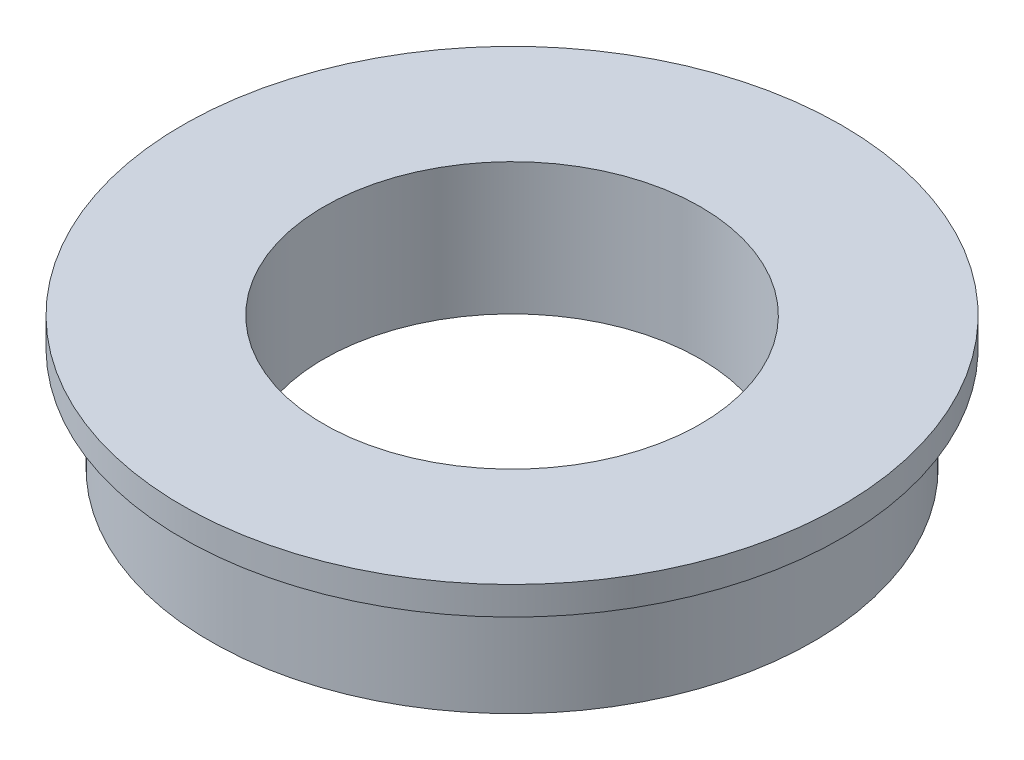
ISO-10303-21;
HEADER;
FILE_DESCRIPTION(('STEP AP214'),'2;1');
FILE_NAME('part.step','',(''),(''),'','','');
FILE_SCHEMA(('AUTOMOTIVE_DESIGN { 1 0 10303 214 1 1 1 1 }'));
ENDSEC;
DATA;
#1=APPLICATION_CONTEXT('core data for automotive mechanical design processes');
#2=APPLICATION_PROTOCOL_DEFINITION('international standard','automotive_design',2000,#1);
#3=PRODUCT_CONTEXT('',#1,'mechanical');
#4=PRODUCT('Part','Part','',(#3));
#5=PRODUCT_RELATED_PRODUCT_CATEGORY('part','',(#4));
#6=PRODUCT_DEFINITION_FORMATION('','',#4);
#7=PRODUCT_DEFINITION_CONTEXT('part definition',#1,'design');
#8=PRODUCT_DEFINITION('design','',#6,#7);
#9=PRODUCT_DEFINITION_SHAPE('','',#8);
#10=(LENGTH_UNIT() NAMED_UNIT(*) SI_UNIT(.MILLI.,.METRE.));
#11=(NAMED_UNIT(*) PLANE_ANGLE_UNIT() SI_UNIT($,.RADIAN.));
#12=(NAMED_UNIT(*) SI_UNIT($,.STERADIAN.) SOLID_ANGLE_UNIT());
#13=UNCERTAINTY_MEASURE_WITH_UNIT(LENGTH_MEASURE(1.E-05),#10,'distance_accuracy_value','');
#14=(GEOMETRIC_REPRESENTATION_CONTEXT(3) GLOBAL_UNCERTAINTY_ASSIGNED_CONTEXT((#13)) GLOBAL_UNIT_ASSIGNED_CONTEXT((#10,
#11,#12)) REPRESENTATION_CONTEXT('',''));
#15=CARTESIAN_POINT('',(0.,0.,0.));
#16=DIRECTION('',(0.,0.,1.));
#17=DIRECTION('',(1.,0.,0.));
#18=AXIS2_PLACEMENT_3D('',#15,#16,#17);
#19=CARTESIAN_POINT('',(0.,-7.37837869532181,0.));
#20=DIRECTION('',(0.,-1.,0.));
#21=DIRECTION('',(0.,0.,-1.));
#22=AXIS2_PLACEMENT_3D('',#19,#20,#21);
#23=CYLINDRICAL_SURFACE('',#22,10.);
#24=CARTESIAN_POINT('',(0.,-7.,0.));
#25=DIRECTION('',(0.,-1.,0.));
#26=DIRECTION('',(0.,0.,-1.));
#27=AXIS2_PLACEMENT_3D('',#24,#25,#26);
#28=CIRCLE('',#27,10.);
#29=CARTESIAN_POINT('',(0.,-7.,-10.));
#30=VERTEX_POINT('',#29);
#31=EDGE_CURVE('E56',#30,#30,#28,.T.);
#32=ORIENTED_EDGE('',*,*,#31,.T.);
#33=EDGE_LOOP('',(#32));
#34=FACE_BOUND('',#33,.T.);
#35=CARTESIAN_POINT('',(0.,0.,0.));
#36=DIRECTION('',(0.,-1.,0.));
#37=DIRECTION('',(0.,0.,-1.));
#38=AXIS2_PLACEMENT_3D('',#35,#36,#37);
#39=CIRCLE('',#38,10.);
#40=CARTESIAN_POINT('',(0.,0.,-10.));
#41=VERTEX_POINT('',#40);
#42=EDGE_CURVE('E10',#41,#41,#39,.T.);
#43=ORIENTED_EDGE('',*,*,#42,.F.);
#44=EDGE_LOOP('',(#43));
#45=FACE_BOUND('',#44,.T.);
#46=ADVANCED_FACE('F34',(#34,#45),#23,.F.);
#47=CARTESIAN_POINT('',(10.,0.,0.));
#48=DIRECTION('',(0.,1.,0.));
#49=DIRECTION('',(0.,0.,1.));
#50=AXIS2_PLACEMENT_3D('',#47,#48,#49);
#51=PLANE('',#50);
#52=ORIENTED_EDGE('',*,*,#42,.T.);
#53=EDGE_LOOP('',(#52));
#54=FACE_BOUND('',#53,.T.);
#55=CARTESIAN_POINT('',(0.,0.,0.));
#56=DIRECTION('',(0.,-1.,0.));
#57=DIRECTION('',(0.,0.,-1.));
#58=AXIS2_PLACEMENT_3D('',#55,#56,#57);
#59=CIRCLE('',#58,17.5);
#60=CARTESIAN_POINT('',(0.,0.,-17.5));
#61=VERTEX_POINT('',#60);
#62=EDGE_CURVE('E40',#61,#61,#59,.T.);
#63=ORIENTED_EDGE('',*,*,#62,.F.);
#64=EDGE_LOOP('',(#63));
#65=FACE_BOUND('',#64,.T.);
#66=ADVANCED_FACE('F74',(#54,#65),#51,.T.);
#67=CARTESIAN_POINT('',(0.,-7.37837869532181,0.));
#68=DIRECTION('',(0.,-1.,0.));
#69=DIRECTION('',(0.,0.,-1.));
#70=AXIS2_PLACEMENT_3D('',#67,#68,#69);
#71=CYLINDRICAL_SURFACE('',#70,17.5);
#72=ORIENTED_EDGE('',*,*,#62,.T.);
#73=EDGE_LOOP('',(#72));
#74=FACE_BOUND('',#73,.T.);
#75=CARTESIAN_POINT('',(0.,-1.5,0.));
#76=DIRECTION('',(0.,-1.,0.));
#77=DIRECTION('',(0.,0.,-1.));
#78=AXIS2_PLACEMENT_3D('',#75,#76,#77);
#79=CIRCLE('',#78,17.5);
#80=CARTESIAN_POINT('',(0.,-1.5,-17.5));
#81=VERTEX_POINT('',#80);
#82=EDGE_CURVE('E44',#81,#81,#79,.T.);
#83=ORIENTED_EDGE('',*,*,#82,.F.);
#84=EDGE_LOOP('',(#83));
#85=FACE_BOUND('',#84,.T.);
#86=ADVANCED_FACE('F79',(#74,#85),#71,.T.);
#87=CARTESIAN_POINT('',(17.5,-1.5,0.));
#88=DIRECTION('',(0.,-1.,0.));
#89=DIRECTION('',(0.,0.,-1.));
#90=AXIS2_PLACEMENT_3D('',#87,#88,#89);
#91=PLANE('',#90);
#92=ORIENTED_EDGE('',*,*,#82,.T.);
#93=EDGE_LOOP('',(#92));
#94=FACE_BOUND('',#93,.T.);
#95=CARTESIAN_POINT('',(0.,-1.5,0.));
#96=DIRECTION('',(0.,-1.,0.));
#97=DIRECTION('',(0.,0.,-1.));
#98=AXIS2_PLACEMENT_3D('',#95,#96,#97);
#99=CIRCLE('',#98,16.);
#100=CARTESIAN_POINT('',(0.,-1.5,-16.));
#101=VERTEX_POINT('',#100);
#102=EDGE_CURVE('E48',#101,#101,#99,.T.);
#103=ORIENTED_EDGE('',*,*,#102,.F.);
#104=EDGE_LOOP('',(#103));
#105=FACE_BOUND('',#104,.T.);
#106=ADVANCED_FACE('F70',(#94,#105),#91,.T.);
#107=CARTESIAN_POINT('',(0.,-7.37837869532181,0.));
#108=DIRECTION('',(0.,-1.,0.));
#109=DIRECTION('',(0.,0.,-1.));
#110=AXIS2_PLACEMENT_3D('',#107,#108,#109);
#111=CYLINDRICAL_SURFACE('',#110,16.);
#112=ORIENTED_EDGE('',*,*,#102,.T.);
#113=EDGE_LOOP('',(#112));
#114=FACE_BOUND('',#113,.T.);
#115=CARTESIAN_POINT('',(0.,-7.,0.));
#116=DIRECTION('',(0.,-1.,0.));
#117=DIRECTION('',(0.,0.,-1.));
#118=AXIS2_PLACEMENT_3D('',#115,#116,#117);
#119=CIRCLE('',#118,16.);
#120=CARTESIAN_POINT('',(0.,-7.,-16.));
#121=VERTEX_POINT('',#120);
#122=EDGE_CURVE('E53',#121,#121,#119,.T.);
#123=ORIENTED_EDGE('',*,*,#122,.F.);
#124=EDGE_LOOP('',(#123));
#125=FACE_BOUND('',#124,.T.);
#126=ADVANCED_FACE('F64',(#114,#125),#111,.T.);
#127=CARTESIAN_POINT('',(16.,-7.,0.));
#128=DIRECTION('',(0.,-1.,0.));
#129=DIRECTION('',(0.,0.,-1.));
#130=AXIS2_PLACEMENT_3D('',#127,#128,#129);
#131=PLANE('',#130);
#132=ORIENTED_EDGE('',*,*,#122,.T.);
#133=EDGE_LOOP('',(#132));
#134=FACE_BOUND('',#133,.T.);
#135=ORIENTED_EDGE('',*,*,#31,.F.);
#136=EDGE_LOOP('',(#135));
#137=FACE_BOUND('',#136,.T.);
#138=ADVANCED_FACE('F62',(#134,#137),#131,.T.);
#139=CLOSED_SHELL('',(#46,#66,#86,#106,#126,#138));
#140=MANIFOLD_SOLID_BREP('B2',#139);
#141=ADVANCED_BREP_SHAPE_REPRESENTATION('',(#18,#140),#14);
#142=SHAPE_DEFINITION_REPRESENTATION(#9,#141);
ENDSEC;
END-ISO-10303-21;
